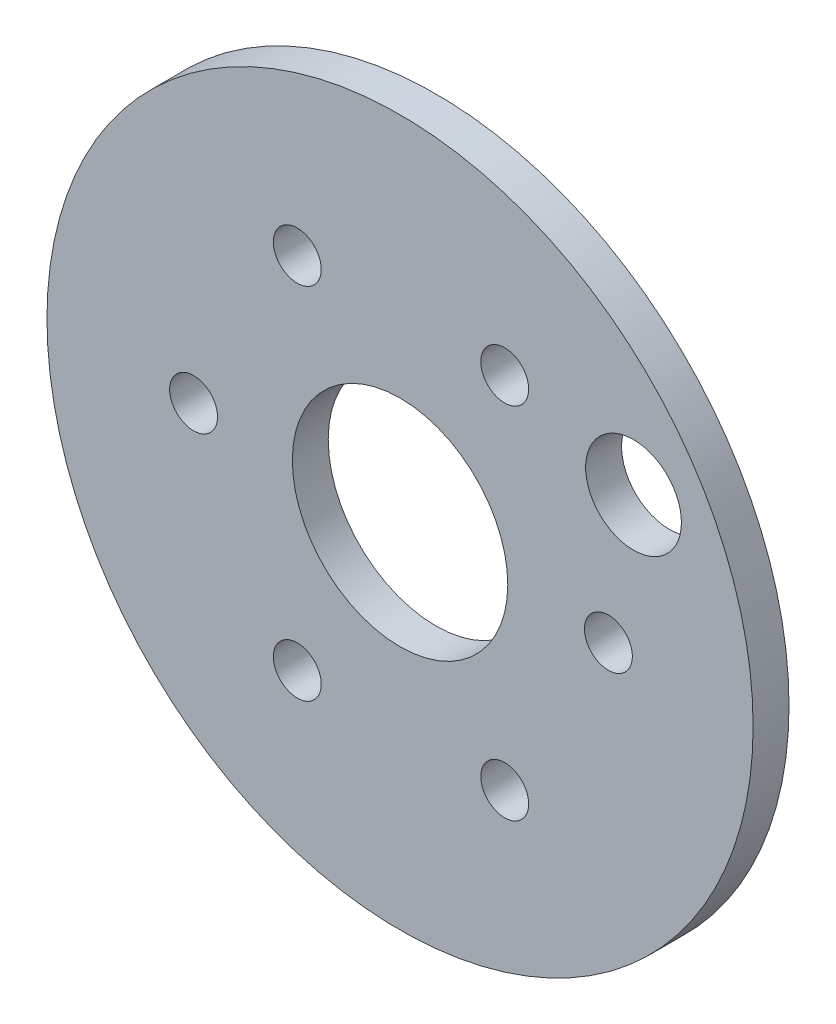
ISO-10303-21;
HEADER;
FILE_DESCRIPTION(('STEP AP214'),'2;1');
FILE_NAME('part.step','',(''),(''),'','','');
FILE_SCHEMA(('AUTOMOTIVE_DESIGN { 1 0 10303 214 1 1 1 1 }'));
ENDSEC;
DATA;
#1=APPLICATION_CONTEXT('core data for automotive mechanical design processes');
#2=APPLICATION_PROTOCOL_DEFINITION('international standard','automotive_design',2000,#1);
#3=PRODUCT_CONTEXT('',#1,'mechanical');
#4=PRODUCT('Part','Part','',(#3));
#5=PRODUCT_RELATED_PRODUCT_CATEGORY('part','',(#4));
#6=PRODUCT_DEFINITION_FORMATION('','',#4);
#7=PRODUCT_DEFINITION_CONTEXT('part definition',#1,'design');
#8=PRODUCT_DEFINITION('design','',#6,#7);
#9=PRODUCT_DEFINITION_SHAPE('','',#8);
#10=(LENGTH_UNIT() NAMED_UNIT(*) SI_UNIT(.MILLI.,.METRE.));
#11=(NAMED_UNIT(*) PLANE_ANGLE_UNIT() SI_UNIT($,.RADIAN.));
#12=(NAMED_UNIT(*) SI_UNIT($,.STERADIAN.) SOLID_ANGLE_UNIT());
#13=UNCERTAINTY_MEASURE_WITH_UNIT(LENGTH_MEASURE(1.E-05),#10,'distance_accuracy_value','');
#14=(GEOMETRIC_REPRESENTATION_CONTEXT(3) GLOBAL_UNCERTAINTY_ASSIGNED_CONTEXT((#13)) GLOBAL_UNIT_ASSIGNED_CONTEXT((#10,
#11,#12)) REPRESENTATION_CONTEXT('',''));
#15=CARTESIAN_POINT('',(0.,0.,0.));
#16=DIRECTION('',(0.,0.,1.));
#17=DIRECTION('',(1.,0.,0.));
#18=AXIS2_PLACEMENT_3D('',#15,#16,#17);
#19=CARTESIAN_POINT('',(0.,0.,3.));
#20=DIRECTION('',(0.,0.,-1.));
#21=DIRECTION('',(-1.,0.,0.));
#22=AXIS2_PLACEMENT_3D('',#19,#20,#21);
#23=CYLINDRICAL_SURFACE('',#22,29.5);
#24=CARTESIAN_POINT('',(0.,0.,3.));
#25=DIRECTION('',(0.,0.,1.));
#26=DIRECTION('',(1.,0.,0.));
#27=AXIS2_PLACEMENT_3D('',#24,#25,#26);
#28=CIRCLE('',#27,29.5);
#29=CARTESIAN_POINT('',(29.5,0.,3.));
#30=VERTEX_POINT('',#29);
#31=EDGE_CURVE('E10',#30,#30,#28,.T.);
#32=ORIENTED_EDGE('',*,*,#31,.F.);
#33=EDGE_LOOP('',(#32));
#34=FACE_BOUND('',#33,.T.);
#35=CARTESIAN_POINT('',(0.,0.,0.));
#36=DIRECTION('',(0.,0.,1.));
#37=DIRECTION('',(1.,0.,0.));
#38=AXIS2_PLACEMENT_3D('',#35,#36,#37);
#39=CIRCLE('',#38,29.5);
#40=CARTESIAN_POINT('',(29.5,0.,0.));
#41=VERTEX_POINT('',#40);
#42=EDGE_CURVE('E46',#41,#41,#39,.T.);
#43=ORIENTED_EDGE('',*,*,#42,.T.);
#44=EDGE_LOOP('',(#43));
#45=FACE_BOUND('',#44,.T.);
#46=ADVANCED_FACE('F39',(#34,#45),#23,.T.);
#47=CARTESIAN_POINT('',(0.,0.,3.));
#48=DIRECTION('',(0.,0.,1.));
#49=DIRECTION('',(1.,0.,0.));
#50=AXIS2_PLACEMENT_3D('',#47,#48,#49);
#51=PLANE('',#50);
#52=CARTESIAN_POINT('',(19.5072467735477,11.7414542400566,3.));
#53=DIRECTION('',(0.,0.,1.));
#54=DIRECTION('',(1.,0.,0.));
#55=AXIS2_PLACEMENT_3D('',#52,#53,#54);
#56=CIRCLE('',#55,4.);
#57=CARTESIAN_POINT('',(23.5072467735477,11.7414542400566,3.));
#58=VERTEX_POINT('',#57);
#59=EDGE_CURVE('E94',#58,#58,#56,.T.);
#60=ORIENTED_EDGE('',*,*,#59,.F.);
#61=EDGE_LOOP('',(#60));
#62=FACE_BOUND('',#61,.T.);
#63=CARTESIAN_POINT('',(0.,0.,3.));
#64=DIRECTION('',(0.,0.,1.));
#65=DIRECTION('',(1.,0.,0.));
#66=AXIS2_PLACEMENT_3D('',#63,#64,#65);
#67=CIRCLE('',#66,9.);
#68=CARTESIAN_POINT('',(9.,0.,3.));
#69=VERTEX_POINT('',#68);
#70=EDGE_CURVE('E89',#69,#69,#67,.T.);
#71=ORIENTED_EDGE('',*,*,#70,.F.);
#72=EDGE_LOOP('',(#71));
#73=FACE_BOUND('',#72,.T.);
#74=CARTESIAN_POINT('',(-8.58517316017333,15.0079203253665,3.));
#75=DIRECTION('',(0.,0.,1.));
#76=DIRECTION('',(0.50000000000001,-0.866025403784433,0.));
#77=AXIS2_PLACEMENT_3D('',#74,#75,#76);
#78=CIRCLE('',#77,2.);
#79=CARTESIAN_POINT('',(-7.58517316017331,13.2758695177976,3.));
#80=VERTEX_POINT('',#79);
#81=EDGE_CURVE('E65',#80,#80,#78,.T.);
#82=ORIENTED_EDGE('',*,*,#81,.F.);
#83=EDGE_LOOP('',(#82));
#84=FACE_BOUND('',#83,.T.);
#85=CARTESIAN_POINT('',(8.74448051948038,15.0079203253666,3.));
#86=DIRECTION('',(0.,0.,1.));
#87=DIRECTION('',(-0.499999999999992,-0.866025403784443,0.));
#88=AXIS2_PLACEMENT_3D('',#85,#86,#87);
#89=CIRCLE('',#88,2.);
#90=CARTESIAN_POINT('',(7.7444805194804,13.2758695177978,3.));
#91=VERTEX_POINT('',#90);
#92=EDGE_CURVE('E72',#91,#91,#89,.T.);
#93=ORIENTED_EDGE('',*,*,#92,.F.);
#94=EDGE_LOOP('',(#93));
#95=FACE_BOUND('',#94,.T.);
#96=CARTESIAN_POINT('',(17.4093073593074,0.,3.));
#97=DIRECTION('',(0.,0.,1.));
#98=DIRECTION('',(-1.,0.,0.));
#99=AXIS2_PLACEMENT_3D('',#96,#97,#98);
#100=CIRCLE('',#99,2.);
#101=CARTESIAN_POINT('',(15.4093073593074,0.,3.));
#102=VERTEX_POINT('',#101);
#103=EDGE_CURVE('E78',#102,#102,#100,.T.);
#104=ORIENTED_EDGE('',*,*,#103,.F.);
#105=EDGE_LOOP('',(#104));
#106=FACE_BOUND('',#105,.T.);
#107=CARTESIAN_POINT('',(8.74448051948059,-15.0079203253665,3.));
#108=DIRECTION('',(0.,0.,1.));
#109=DIRECTION('',(-0.500000000000004,0.866025403784436,0.));
#110=AXIS2_PLACEMENT_3D('',#107,#108,#109);
#111=CIRCLE('',#110,2.);
#112=CARTESIAN_POINT('',(7.74448051948058,-13.2758695177976,3.));
#113=VERTEX_POINT('',#112);
#114=EDGE_CURVE('E84',#113,#113,#111,.T.);
#115=ORIENTED_EDGE('',*,*,#114,.F.);
#116=EDGE_LOOP('',(#115));
#117=FACE_BOUND('',#116,.T.);
#118=CARTESIAN_POINT('',(-8.58517316017312,-15.0079203253666,3.));
#119=DIRECTION('',(0.,0.,1.));
#120=DIRECTION('',(0.499999999999998,0.86602540378444,0.));
#121=AXIS2_PLACEMENT_3D('',#118,#119,#120);
#122=CIRCLE('',#121,2.);
#123=CARTESIAN_POINT('',(-7.58517316017313,-13.2758695177977,3.));
#124=VERTEX_POINT('',#123);
#125=EDGE_CURVE('E59',#124,#124,#122,.T.);
#126=ORIENTED_EDGE('',*,*,#125,.F.);
#127=EDGE_LOOP('',(#126));
#128=FACE_BOUND('',#127,.T.);
#129=CARTESIAN_POINT('',(-17.25,0.,3.));
#130=DIRECTION('',(0.,0.,1.));
#131=DIRECTION('',(1.,0.,0.));
#132=AXIS2_PLACEMENT_3D('',#129,#130,#131);
#133=CIRCLE('',#132,2.);
#134=CARTESIAN_POINT('',(-15.25,0.,3.));
#135=VERTEX_POINT('',#134);
#136=EDGE_CURVE('E53',#135,#135,#133,.T.);
#137=ORIENTED_EDGE('',*,*,#136,.F.);
#138=EDGE_LOOP('',(#137));
#139=FACE_BOUND('',#138,.T.);
#140=ORIENTED_EDGE('',*,*,#31,.T.);
#141=EDGE_LOOP('',(#140));
#142=FACE_BOUND('',#141,.T.);
#143=ADVANCED_FACE('F116',(#62,#73,#84,#95,#106,#117,#128,#139,#142),#51,.T.);
#144=CARTESIAN_POINT('',(0.,0.,0.));
#145=DIRECTION('',(0.,0.,1.));
#146=DIRECTION('',(1.,0.,0.));
#147=AXIS2_PLACEMENT_3D('',#144,#145,#146);
#148=PLANE('',#147);
#149=CARTESIAN_POINT('',(19.5072467735477,11.7414542400566,0.));
#150=DIRECTION('',(0.,0.,1.));
#151=DIRECTION('',(1.,0.,0.));
#152=AXIS2_PLACEMENT_3D('',#149,#150,#151);
#153=CIRCLE('',#152,4.);
#154=CARTESIAN_POINT('',(23.5072467735477,11.7414542400566,0.));
#155=VERTEX_POINT('',#154);
#156=EDGE_CURVE('E42',#155,#155,#153,.T.);
#157=ORIENTED_EDGE('',*,*,#156,.T.);
#158=EDGE_LOOP('',(#157));
#159=FACE_BOUND('',#158,.T.);
#160=CARTESIAN_POINT('',(0.,0.,0.));
#161=DIRECTION('',(0.,0.,1.));
#162=DIRECTION('',(1.,0.,0.));
#163=AXIS2_PLACEMENT_3D('',#160,#161,#162);
#164=CIRCLE('',#163,9.);
#165=CARTESIAN_POINT('',(9.,0.,0.));
#166=VERTEX_POINT('',#165);
#167=EDGE_CURVE('E69',#166,#166,#164,.T.);
#168=ORIENTED_EDGE('',*,*,#167,.T.);
#169=EDGE_LOOP('',(#168));
#170=FACE_BOUND('',#169,.T.);
#171=CARTESIAN_POINT('',(-8.58517316017333,15.0079203253665,0.));
#172=DIRECTION('',(0.,0.,1.));
#173=DIRECTION('',(0.50000000000001,-0.866025403784433,0.));
#174=AXIS2_PLACEMENT_3D('',#171,#172,#173);
#175=CIRCLE('',#174,2.);
#176=CARTESIAN_POINT('',(-7.58517316017331,13.2758695177976,0.));
#177=VERTEX_POINT('',#176);
#178=EDGE_CURVE('E68',#177,#177,#175,.T.);
#179=ORIENTED_EDGE('',*,*,#178,.T.);
#180=EDGE_LOOP('',(#179));
#181=FACE_BOUND('',#180,.T.);
#182=CARTESIAN_POINT('',(8.74448051948038,15.0079203253666,0.));
#183=DIRECTION('',(0.,0.,1.));
#184=DIRECTION('',(-0.499999999999992,-0.866025403784443,0.));
#185=AXIS2_PLACEMENT_3D('',#182,#183,#184);
#186=CIRCLE('',#185,2.);
#187=CARTESIAN_POINT('',(7.7444805194804,13.2758695177978,0.));
#188=VERTEX_POINT('',#187);
#189=EDGE_CURVE('E75',#188,#188,#186,.T.);
#190=ORIENTED_EDGE('',*,*,#189,.T.);
#191=EDGE_LOOP('',(#190));
#192=FACE_BOUND('',#191,.T.);
#193=CARTESIAN_POINT('',(17.4093073593074,0.,0.));
#194=DIRECTION('',(0.,0.,1.));
#195=DIRECTION('',(-1.,0.,0.));
#196=AXIS2_PLACEMENT_3D('',#193,#194,#195);
#197=CIRCLE('',#196,2.);
#198=CARTESIAN_POINT('',(15.4093073593074,0.,0.));
#199=VERTEX_POINT('',#198);
#200=EDGE_CURVE('E81',#199,#199,#197,.T.);
#201=ORIENTED_EDGE('',*,*,#200,.T.);
#202=EDGE_LOOP('',(#201));
#203=FACE_BOUND('',#202,.T.);
#204=CARTESIAN_POINT('',(8.74448051948059,-15.0079203253665,0.));
#205=DIRECTION('',(0.,0.,1.));
#206=DIRECTION('',(-0.500000000000004,0.866025403784436,0.));
#207=AXIS2_PLACEMENT_3D('',#204,#205,#206);
#208=CIRCLE('',#207,2.);
#209=CARTESIAN_POINT('',(7.74448051948058,-13.2758695177976,0.));
#210=VERTEX_POINT('',#209);
#211=EDGE_CURVE('E62',#210,#210,#208,.T.);
#212=ORIENTED_EDGE('',*,*,#211,.T.);
#213=EDGE_LOOP('',(#212));
#214=FACE_BOUND('',#213,.T.);
#215=CARTESIAN_POINT('',(-8.58517316017312,-15.0079203253666,0.));
#216=DIRECTION('',(0.,0.,1.));
#217=DIRECTION('',(0.499999999999998,0.86602540378444,0.));
#218=AXIS2_PLACEMENT_3D('',#215,#216,#217);
#219=CIRCLE('',#218,2.);
#220=CARTESIAN_POINT('',(-7.58517316017313,-13.2758695177977,0.));
#221=VERTEX_POINT('',#220);
#222=EDGE_CURVE('E56',#221,#221,#219,.T.);
#223=ORIENTED_EDGE('',*,*,#222,.T.);
#224=EDGE_LOOP('',(#223));
#225=FACE_BOUND('',#224,.T.);
#226=CARTESIAN_POINT('',(-17.25,0.,0.));
#227=DIRECTION('',(0.,0.,1.));
#228=DIRECTION('',(1.,0.,0.));
#229=AXIS2_PLACEMENT_3D('',#226,#227,#228);
#230=CIRCLE('',#229,2.);
#231=CARTESIAN_POINT('',(-15.25,0.,0.));
#232=VERTEX_POINT('',#231);
#233=EDGE_CURVE('E51',#232,#232,#230,.T.);
#234=ORIENTED_EDGE('',*,*,#233,.T.);
#235=EDGE_LOOP('',(#234));
#236=FACE_BOUND('',#235,.T.);
#237=ORIENTED_EDGE('',*,*,#42,.F.);
#238=EDGE_LOOP('',(#237));
#239=FACE_BOUND('',#238,.T.);
#240=ADVANCED_FACE('F101',(#159,#170,#181,#192,#203,#214,#225,#236,#239),#148,.F.);
#241=CARTESIAN_POINT('',(-17.25,0.,0.));
#242=DIRECTION('',(0.,0.,1.));
#243=DIRECTION('',(1.,0.,0.));
#244=AXIS2_PLACEMENT_3D('',#241,#242,#243);
#245=CYLINDRICAL_SURFACE('',#244,2.);
#246=ORIENTED_EDGE('',*,*,#233,.F.);
#247=EDGE_LOOP('',(#246));
#248=FACE_BOUND('',#247,.T.);
#249=ORIENTED_EDGE('',*,*,#136,.T.);
#250=EDGE_LOOP('',(#249));
#251=FACE_BOUND('',#250,.T.);
#252=ADVANCED_FACE('F127',(#248,#251),#245,.F.);
#253=CARTESIAN_POINT('',(-8.58517316017312,-15.0079203253666,0.));
#254=DIRECTION('',(0.,0.,1.));
#255=DIRECTION('',(1.,0.,0.));
#256=AXIS2_PLACEMENT_3D('',#253,#254,#255);
#257=CYLINDRICAL_SURFACE('',#256,2.);
#258=ORIENTED_EDGE('',*,*,#222,.F.);
#259=EDGE_LOOP('',(#258));
#260=FACE_BOUND('',#259,.T.);
#261=ORIENTED_EDGE('',*,*,#125,.T.);
#262=EDGE_LOOP('',(#261));
#263=FACE_BOUND('',#262,.T.);
#264=ADVANCED_FACE('F130',(#260,#263),#257,.F.);
#265=CARTESIAN_POINT('',(8.74448051948059,-15.0079203253665,0.));
#266=DIRECTION('',(0.,0.,1.));
#267=DIRECTION('',(1.,0.,0.));
#268=AXIS2_PLACEMENT_3D('',#265,#266,#267);
#269=CYLINDRICAL_SURFACE('',#268,2.);
#270=ORIENTED_EDGE('',*,*,#211,.F.);
#271=EDGE_LOOP('',(#270));
#272=FACE_BOUND('',#271,.T.);
#273=ORIENTED_EDGE('',*,*,#114,.T.);
#274=EDGE_LOOP('',(#273));
#275=FACE_BOUND('',#274,.T.);
#276=ADVANCED_FACE('F136',(#272,#275),#269,.F.);
#277=CARTESIAN_POINT('',(17.4093073593074,0.,0.));
#278=DIRECTION('',(0.,0.,1.));
#279=DIRECTION('',(1.,0.,0.));
#280=AXIS2_PLACEMENT_3D('',#277,#278,#279);
#281=CYLINDRICAL_SURFACE('',#280,2.);
#282=ORIENTED_EDGE('',*,*,#200,.F.);
#283=EDGE_LOOP('',(#282));
#284=FACE_BOUND('',#283,.T.);
#285=ORIENTED_EDGE('',*,*,#103,.T.);
#286=EDGE_LOOP('',(#285));
#287=FACE_BOUND('',#286,.T.);
#288=ADVANCED_FACE('F144',(#284,#287),#281,.F.);
#289=CARTESIAN_POINT('',(8.74448051948038,15.0079203253666,0.));
#290=DIRECTION('',(0.,0.,1.));
#291=DIRECTION('',(1.,0.,0.));
#292=AXIS2_PLACEMENT_3D('',#289,#290,#291);
#293=CYLINDRICAL_SURFACE('',#292,2.);
#294=ORIENTED_EDGE('',*,*,#189,.F.);
#295=EDGE_LOOP('',(#294));
#296=FACE_BOUND('',#295,.T.);
#297=ORIENTED_EDGE('',*,*,#92,.T.);
#298=EDGE_LOOP('',(#297));
#299=FACE_BOUND('',#298,.T.);
#300=ADVANCED_FACE('F140',(#296,#299),#293,.F.);
#301=CARTESIAN_POINT('',(-8.58517316017333,15.0079203253665,0.));
#302=DIRECTION('',(0.,0.,1.));
#303=DIRECTION('',(1.,0.,0.));
#304=AXIS2_PLACEMENT_3D('',#301,#302,#303);
#305=CYLINDRICAL_SURFACE('',#304,2.);
#306=ORIENTED_EDGE('',*,*,#178,.F.);
#307=EDGE_LOOP('',(#306));
#308=FACE_BOUND('',#307,.T.);
#309=ORIENTED_EDGE('',*,*,#81,.T.);
#310=EDGE_LOOP('',(#309));
#311=FACE_BOUND('',#310,.T.);
#312=ADVANCED_FACE('F112',(#308,#311),#305,.F.);
#313=CARTESIAN_POINT('',(0.,0.,0.));
#314=DIRECTION('',(0.,0.,1.));
#315=DIRECTION('',(1.,0.,0.));
#316=AXIS2_PLACEMENT_3D('',#313,#314,#315);
#317=CYLINDRICAL_SURFACE('',#316,9.);
#318=ORIENTED_EDGE('',*,*,#167,.F.);
#319=EDGE_LOOP('',(#318));
#320=FACE_BOUND('',#319,.T.);
#321=ORIENTED_EDGE('',*,*,#70,.T.);
#322=EDGE_LOOP('',(#321));
#323=FACE_BOUND('',#322,.T.);
#324=ADVANCED_FACE('F106',(#320,#323),#317,.F.);
#325=CARTESIAN_POINT('',(19.5072467735477,11.7414542400566,-7.));
#326=DIRECTION('',(0.,0.,1.));
#327=DIRECTION('',(1.,0.,0.));
#328=AXIS2_PLACEMENT_3D('',#325,#326,#327);
#329=CYLINDRICAL_SURFACE('',#328,4.);
#330=ORIENTED_EDGE('',*,*,#59,.T.);
#331=EDGE_LOOP('',(#330));
#332=FACE_BOUND('',#331,.T.);
#333=ORIENTED_EDGE('',*,*,#156,.F.);
#334=EDGE_LOOP('',(#333));
#335=FACE_BOUND('',#334,.T.);
#336=ADVANCED_FACE('F104',(#332,#335),#329,.F.);
#337=CLOSED_SHELL('',(#46,#143,#240,#252,#264,#276,#288,#300,#312,#324,#336));
#338=MANIFOLD_SOLID_BREP('B2',#337);
#339=ADVANCED_BREP_SHAPE_REPRESENTATION('',(#18,#338),#14);
#340=SHAPE_DEFINITION_REPRESENTATION(#9,#339);
ENDSEC;
END-ISO-10303-21;
